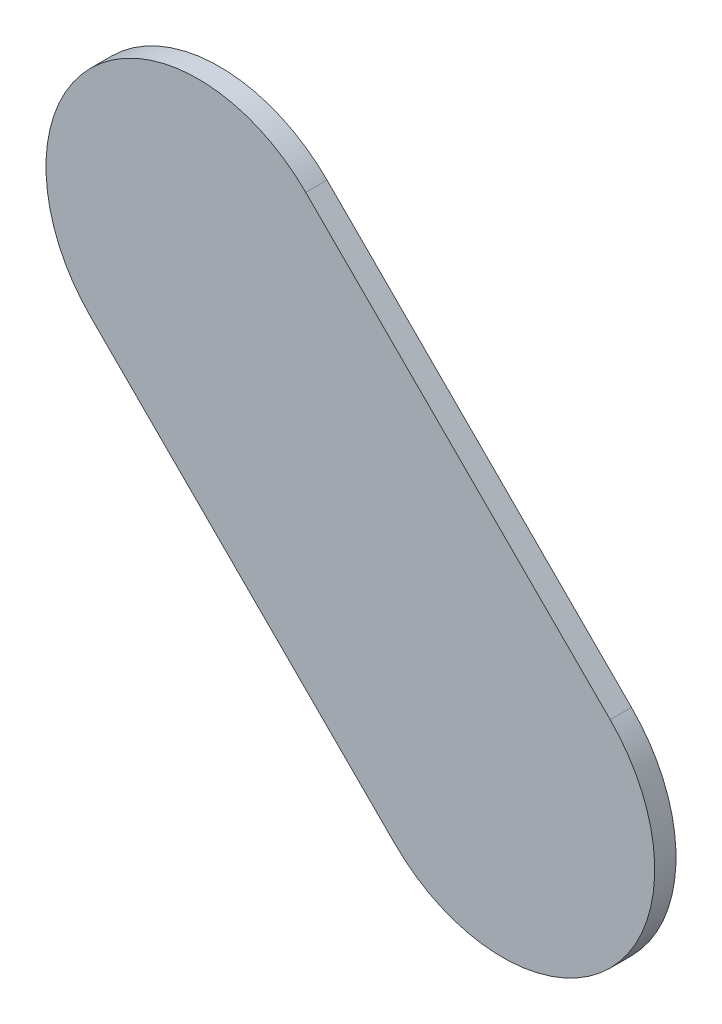
ISO-10303-21;
HEADER;
FILE_DESCRIPTION(('STEP AP214'),'2;1');
FILE_NAME('part.step','',(''),(''),'','','');
FILE_SCHEMA(('AUTOMOTIVE_DESIGN { 1 0 10303 214 1 1 1 1 }'));
ENDSEC;
DATA;
#1=APPLICATION_CONTEXT('core data for automotive mechanical design processes');
#2=APPLICATION_PROTOCOL_DEFINITION('international standard','automotive_design',2000,#1);
#3=PRODUCT_CONTEXT('',#1,'mechanical');
#4=PRODUCT('Part','Part','',(#3));
#5=PRODUCT_RELATED_PRODUCT_CATEGORY('part','',(#4));
#6=PRODUCT_DEFINITION_FORMATION('','',#4);
#7=PRODUCT_DEFINITION_CONTEXT('part definition',#1,'design');
#8=PRODUCT_DEFINITION('design','',#6,#7);
#9=PRODUCT_DEFINITION_SHAPE('','',#8);
#10=(LENGTH_UNIT() NAMED_UNIT(*) SI_UNIT(.MILLI.,.METRE.));
#11=(NAMED_UNIT(*) PLANE_ANGLE_UNIT() SI_UNIT($,.RADIAN.));
#12=(NAMED_UNIT(*) SI_UNIT($,.STERADIAN.) SOLID_ANGLE_UNIT());
#13=UNCERTAINTY_MEASURE_WITH_UNIT(LENGTH_MEASURE(1.E-05),#10,'distance_accuracy_value','');
#14=(GEOMETRIC_REPRESENTATION_CONTEXT(3) GLOBAL_UNCERTAINTY_ASSIGNED_CONTEXT((#13)) GLOBAL_UNIT_ASSIGNED_CONTEXT((#10,
#11,#12)) REPRESENTATION_CONTEXT('',''));
#15=CARTESIAN_POINT('',(0.,0.,0.));
#16=DIRECTION('',(0.,0.,1.));
#17=DIRECTION('',(1.,0.,0.));
#18=AXIS2_PLACEMENT_3D('',#15,#16,#17);
#19=CARTESIAN_POINT('',(123.113224,-58.876777,1.635));
#20=DIRECTION('',(0.,0.,1.));
#21=DIRECTION('',(1.,0.,0.));
#22=AXIS2_PLACEMENT_3D('',#19,#20,#21);
#23=PLANE('',#22);
#24=DIRECTION('',(0.707106781186548,-0.707106781186548,0.));
#25=VECTOR('',#24,1.);
#26=CARTESIAN_POINT('',(123.113224,-58.876777,1.635));
#27=LINE('',#26,#25);
#28=CARTESIAN_POINT('',(123.113224,-58.876777,1.635));
#29=VERTEX_POINT('',#28);
#30=CARTESIAN_POINT('',(123.613223,-59.376776,1.635));
#31=VERTEX_POINT('',#30);
#32=EDGE_CURVE('E75',#29,#31,#27,.T.);
#33=ORIENTED_EDGE('',*,*,#32,.T.);
#34=CARTESIAN_POINT('',(123.7899995,-59.1999995,1.635));
#35=DIRECTION('',(0.,0.,1.));
#36=DIRECTION('',(-0.707106781186548,-0.707106781186548,0.));
#37=AXIS2_PLACEMENT_3D('',#34,#35,#36);
#38=CIRCLE('',#37,0.249999723809);
#39=CARTESIAN_POINT('',(123.966776,-59.023223,1.635));
#40=VERTEX_POINT('',#39);
#41=EDGE_CURVE('E73',#31,#40,#38,.T.);
#42=ORIENTED_EDGE('',*,*,#41,.T.);
#43=DIRECTION('',(-0.707106781186548,0.707106781186548,0.));
#44=VECTOR('',#43,1.);
#45=CARTESIAN_POINT('',(123.966776,-59.023223,1.635));
#46=LINE('',#45,#44);
#47=CARTESIAN_POINT('',(123.466777,-58.523224,1.635));
#48=VERTEX_POINT('',#47);
#49=EDGE_CURVE('E62',#40,#48,#46,.T.);
#50=ORIENTED_EDGE('',*,*,#49,.T.);
#51=CARTESIAN_POINT('',(123.2900005,-58.7000005,1.635));
#52=DIRECTION('',(0.,0.,1.));
#53=DIRECTION('',(0.707106781186548,0.707106781186548,0.));
#54=AXIS2_PLACEMENT_3D('',#51,#52,#53);
#55=CIRCLE('',#54,0.249999723809);
#56=EDGE_CURVE('E11',#48,#29,#55,.T.);
#57=ORIENTED_EDGE('',*,*,#56,.T.);
#58=EDGE_LOOP('',(#33,#42,#50,#57));
#59=FACE_BOUND('',#58,.T.);
#60=ADVANCED_FACE('F17',(#59),#23,.T.);
#61=CARTESIAN_POINT('',(123.113224,-58.876777,1.6));
#62=DIRECTION('',(0.,0.,1.));
#63=DIRECTION('',(1.,0.,0.));
#64=AXIS2_PLACEMENT_3D('',#61,#62,#63);
#65=PLANE('',#64);
#66=CARTESIAN_POINT('',(123.2900005,-58.7000005,1.6));
#67=DIRECTION('',(0.,0.,1.));
#68=DIRECTION('',(0.707106781186548,0.707106781186548,0.));
#69=AXIS2_PLACEMENT_3D('',#66,#67,#68);
#70=CIRCLE('',#69,0.249999723809);
#71=CARTESIAN_POINT('',(123.466777,-58.523224,1.6));
#72=VERTEX_POINT('',#71);
#73=CARTESIAN_POINT('',(123.113224,-58.876777,1.6));
#74=VERTEX_POINT('',#73);
#75=EDGE_CURVE('E21',#72,#74,#70,.T.);
#76=ORIENTED_EDGE('',*,*,#75,.F.);
#77=DIRECTION('',(-0.707106781186548,0.707106781186548,0.));
#78=VECTOR('',#77,1.);
#79=CARTESIAN_POINT('',(123.966776,-59.023223,1.6));
#80=LINE('',#79,#78);
#81=CARTESIAN_POINT('',(123.966776,-59.023223,1.6));
#82=VERTEX_POINT('',#81);
#83=EDGE_CURVE('E80',#82,#72,#80,.T.);
#84=ORIENTED_EDGE('',*,*,#83,.F.);
#85=CARTESIAN_POINT('',(123.7899995,-59.1999995,1.6));
#86=DIRECTION('',(0.,0.,1.));
#87=DIRECTION('',(-0.707106781186548,-0.707106781186548,0.));
#88=AXIS2_PLACEMENT_3D('',#85,#86,#87);
#89=CIRCLE('',#88,0.249999723809);
#90=CARTESIAN_POINT('',(123.613223,-59.376776,1.6));
#91=VERTEX_POINT('',#90);
#92=EDGE_CURVE('E84',#91,#82,#89,.T.);
#93=ORIENTED_EDGE('',*,*,#92,.F.);
#94=DIRECTION('',(0.707106781186548,-0.707106781186548,0.));
#95=VECTOR('',#94,1.);
#96=CARTESIAN_POINT('',(123.113224,-58.876777,1.6));
#97=LINE('',#96,#95);
#98=EDGE_CURVE('E101',#74,#91,#97,.T.);
#99=ORIENTED_EDGE('',*,*,#98,.F.);
#100=EDGE_LOOP('',(#76,#84,#93,#99));
#101=FACE_BOUND('',#100,.T.);
#102=ADVANCED_FACE('F19',(#101),#65,.F.);
#103=CARTESIAN_POINT('',(123.2900005,-58.7000005,1.6));
#104=DIRECTION('',(0.,0.,-1.));
#105=DIRECTION('',(0.707106781186548,0.707106781186548,0.));
#106=AXIS2_PLACEMENT_3D('',#103,#104,#105);
#107=CYLINDRICAL_SURFACE('',#106,0.249999723809);
#108=ORIENTED_EDGE('',*,*,#75,.T.);
#109=DIRECTION('',(0.,0.,1.));
#110=VECTOR('',#109,1.);
#111=CARTESIAN_POINT('',(123.113224,-58.876777,1.6));
#112=LINE('',#111,#110);
#113=EDGE_CURVE('E91',#74,#29,#112,.T.);
#114=ORIENTED_EDGE('',*,*,#113,.T.);
#115=ORIENTED_EDGE('',*,*,#56,.F.);
#116=DIRECTION('',(0.,0.,1.));
#117=VECTOR('',#116,1.);
#118=CARTESIAN_POINT('',(123.466777,-58.523224,1.6));
#119=LINE('',#118,#117);
#120=EDGE_CURVE('E69',#72,#48,#119,.T.);
#121=ORIENTED_EDGE('',*,*,#120,.F.);
#122=EDGE_LOOP('',(#108,#114,#115,#121));
#123=FACE_BOUND('',#122,.T.);
#124=ADVANCED_FACE('F174',(#123),#107,.T.);
#125=CARTESIAN_POINT('',(123.966776,-59.023223,1.6));
#126=DIRECTION('',(-0.707106781186548,-0.707106781186548,0.));
#127=DIRECTION('',(-0.707106781186548,0.707106781186548,0.));
#128=AXIS2_PLACEMENT_3D('',#125,#126,#127);
#129=PLANE('',#128);
#130=ORIENTED_EDGE('',*,*,#83,.T.);
#131=ORIENTED_EDGE('',*,*,#120,.T.);
#132=ORIENTED_EDGE('',*,*,#49,.F.);
#133=DIRECTION('',(0.,0.,1.));
#134=VECTOR('',#133,1.);
#135=CARTESIAN_POINT('',(123.966776,-59.023223,1.6));
#136=LINE('',#135,#134);
#137=EDGE_CURVE('E67',#82,#40,#136,.T.);
#138=ORIENTED_EDGE('',*,*,#137,.F.);
#139=EDGE_LOOP('',(#130,#131,#132,#138));
#140=FACE_BOUND('',#139,.T.);
#141=ADVANCED_FACE('F65',(#140),#129,.F.);
#142=CARTESIAN_POINT('',(123.7899995,-59.1999995,1.6));
#143=DIRECTION('',(0.,0.,-1.));
#144=DIRECTION('',(-0.707106781186548,-0.707106781186548,0.));
#145=AXIS2_PLACEMENT_3D('',#142,#143,#144);
#146=CYLINDRICAL_SURFACE('',#145,0.249999723809);
#147=ORIENTED_EDGE('',*,*,#92,.T.);
#148=ORIENTED_EDGE('',*,*,#137,.T.);
#149=ORIENTED_EDGE('',*,*,#41,.F.);
#150=DIRECTION('',(0.,0.,1.));
#151=VECTOR('',#150,1.);
#152=CARTESIAN_POINT('',(123.613223,-59.376776,1.6));
#153=LINE('',#152,#151);
#154=EDGE_CURVE('E98',#91,#31,#153,.T.);
#155=ORIENTED_EDGE('',*,*,#154,.F.);
#156=EDGE_LOOP('',(#147,#148,#149,#155));
#157=FACE_BOUND('',#156,.T.);
#158=ADVANCED_FACE('F82',(#157),#146,.T.);
#159=CARTESIAN_POINT('',(123.113224,-58.876777,1.6));
#160=DIRECTION('',(0.707106781186548,0.707106781186548,0.));
#161=DIRECTION('',(0.,0.,-1.));
#162=AXIS2_PLACEMENT_3D('',#159,#160,#161);
#163=PLANE('',#162);
#164=ORIENTED_EDGE('',*,*,#98,.T.);
#165=ORIENTED_EDGE('',*,*,#154,.T.);
#166=ORIENTED_EDGE('',*,*,#32,.F.);
#167=ORIENTED_EDGE('',*,*,#113,.F.);
#168=EDGE_LOOP('',(#164,#165,#166,#167));
#169=FACE_BOUND('',#168,.T.);
#170=ADVANCED_FACE('F150',(#169),#163,.F.);
#171=CLOSED_SHELL('',(#60,#102,#124,#141,#158,#170));
#172=MANIFOLD_SOLID_BREP('B1',#171);
#173=ADVANCED_BREP_SHAPE_REPRESENTATION('',(#18,#172),#14);
#174=SHAPE_DEFINITION_REPRESENTATION(#9,#173);
ENDSEC;
END-ISO-10303-21;
